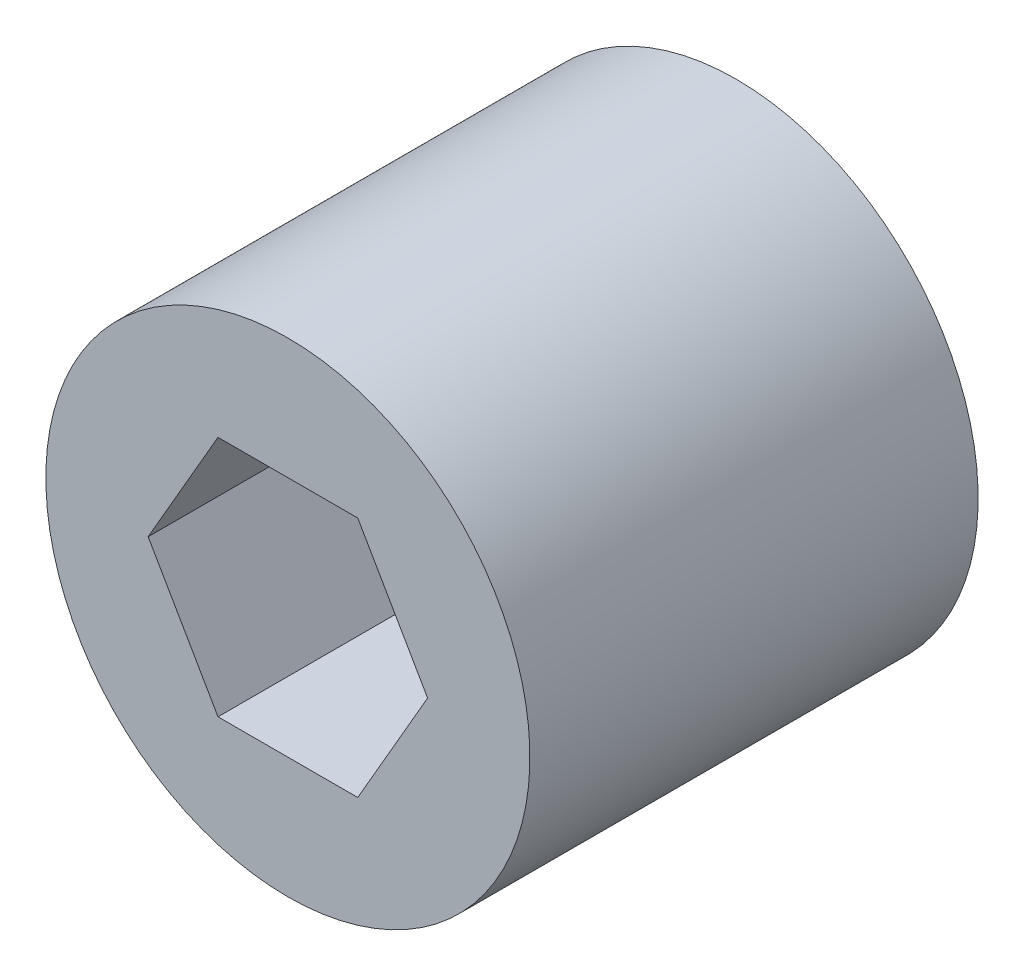
ISO-10303-21;
HEADER;
FILE_DESCRIPTION(('STEP AP214'),'2;1');
FILE_NAME('part.step','',(''),(''),'','','');
FILE_SCHEMA(('AUTOMOTIVE_DESIGN { 1 0 10303 214 1 1 1 1 }'));
ENDSEC;
DATA;
#1=APPLICATION_CONTEXT('core data for automotive mechanical design processes');
#2=APPLICATION_PROTOCOL_DEFINITION('international standard','automotive_design',2000,#1);
#3=PRODUCT_CONTEXT('',#1,'mechanical');
#4=PRODUCT('Part','Part','',(#3));
#5=PRODUCT_RELATED_PRODUCT_CATEGORY('part','',(#4));
#6=PRODUCT_DEFINITION_FORMATION('','',#4);
#7=PRODUCT_DEFINITION_CONTEXT('part definition',#1,'design');
#8=PRODUCT_DEFINITION('design','',#6,#7);
#9=PRODUCT_DEFINITION_SHAPE('','',#8);
#10=(LENGTH_UNIT() NAMED_UNIT(*) SI_UNIT(.MILLI.,.METRE.));
#11=(NAMED_UNIT(*) PLANE_ANGLE_UNIT() SI_UNIT($,.RADIAN.));
#12=(NAMED_UNIT(*) SI_UNIT($,.STERADIAN.) SOLID_ANGLE_UNIT());
#13=UNCERTAINTY_MEASURE_WITH_UNIT(LENGTH_MEASURE(1.E-05),#10,'distance_accuracy_value','');
#14=(GEOMETRIC_REPRESENTATION_CONTEXT(3) GLOBAL_UNCERTAINTY_ASSIGNED_CONTEXT((#13)) GLOBAL_UNIT_ASSIGNED_CONTEXT((#10,
#11,#12)) REPRESENTATION_CONTEXT('',''));
#15=CARTESIAN_POINT('',(0.,0.,0.));
#16=DIRECTION('',(0.,0.,1.));
#17=DIRECTION('',(1.,0.,0.));
#18=AXIS2_PLACEMENT_3D('',#15,#16,#17);
#19=CARTESIAN_POINT('',(0.,8.28601951286423,-23.5204));
#20=DIRECTION('',(0.,0.,1.));
#21=DIRECTION('',(0.,-1.,0.));
#22=AXIS2_PLACEMENT_3D('',#19,#20,#21);
#23=PLANE('',#22);
#24=DIRECTION('',(0.5,0.866025403784439,0.));
#25=VECTOR('',#24,1.);
#26=CARTESIAN_POINT('',(3.66617420935412,-6.35,-23.5204));
#27=LINE('',#26,#25);
#28=CARTESIAN_POINT('',(3.66617420935412,-6.35,-23.5204));
#29=VERTEX_POINT('',#28);
#30=CARTESIAN_POINT('',(7.33234841870825,0.,-23.5204));
#31=VERTEX_POINT('',#30);
#32=EDGE_CURVE('E94',#29,#31,#27,.T.);
#33=ORIENTED_EDGE('',*,*,#32,.T.);
#34=DIRECTION('',(-0.5,0.866025403784438,0.));
#35=VECTOR('',#34,1.);
#36=CARTESIAN_POINT('',(7.33234841870825,0.,-23.5204));
#37=LINE('',#36,#35);
#38=CARTESIAN_POINT('',(3.66617420935412,6.35,-23.5204));
#39=VERTEX_POINT('',#38);
#40=EDGE_CURVE('E88',#31,#39,#37,.T.);
#41=ORIENTED_EDGE('',*,*,#40,.T.);
#42=DIRECTION('',(-1.,0.,0.));
#43=VECTOR('',#42,1.);
#44=CARTESIAN_POINT('',(3.66617420935412,6.35,-23.5204));
#45=LINE('',#44,#43);
#46=CARTESIAN_POINT('',(-3.66617420935412,6.35,-23.5204));
#47=VERTEX_POINT('',#46);
#48=EDGE_CURVE('E97',#39,#47,#45,.T.);
#49=ORIENTED_EDGE('',*,*,#48,.T.);
#50=DIRECTION('',(-0.5,-0.866025403784439,0.));
#51=VECTOR('',#50,1.);
#52=CARTESIAN_POINT('',(-3.66617420935412,6.35,-23.5204));
#53=LINE('',#52,#51);
#54=CARTESIAN_POINT('',(-7.33234841870825,0.,-23.5204));
#55=VERTEX_POINT('',#54);
#56=EDGE_CURVE('E48',#47,#55,#53,.T.);
#57=ORIENTED_EDGE('',*,*,#56,.T.);
#58=DIRECTION('',(0.5,-0.866025403784438,0.));
#59=VECTOR('',#58,1.);
#60=CARTESIAN_POINT('',(-7.33234841870825,0.,-23.5204));
#61=LINE('',#60,#59);
#62=CARTESIAN_POINT('',(-3.66617420935412,-6.35,-23.5204));
#63=VERTEX_POINT('',#62);
#64=EDGE_CURVE('E111',#55,#63,#61,.T.);
#65=ORIENTED_EDGE('',*,*,#64,.T.);
#66=DIRECTION('',(1.,0.,0.));
#67=VECTOR('',#66,1.);
#68=CARTESIAN_POINT('',(-3.66617420935412,-6.35,-23.5204));
#69=LINE('',#68,#67);
#70=EDGE_CURVE('E114',#63,#29,#69,.T.);
#71=ORIENTED_EDGE('',*,*,#70,.T.);
#72=EDGE_LOOP('',(#33,#41,#49,#57,#65,#71));
#73=FACE_BOUND('',#72,.T.);
#74=CARTESIAN_POINT('',(0.,0.,-23.5204));
#75=DIRECTION('',(0.,0.,1.));
#76=DIRECTION('',(0.,-1.,0.));
#77=AXIS2_PLACEMENT_3D('',#74,#75,#76);
#78=CIRCLE('',#77,12.7);
#79=CARTESIAN_POINT('',(0.,-12.7,-23.5204));
#80=VERTEX_POINT('',#79);
#81=EDGE_CURVE('E41',#80,#80,#78,.T.);
#82=ORIENTED_EDGE('',*,*,#81,.F.);
#83=EDGE_LOOP('',(#82));
#84=FACE_BOUND('',#83,.T.);
#85=ADVANCED_FACE('F34',(#73,#84),#23,.F.);
#86=CARTESIAN_POINT('',(0.,8.28601951286423,0.));
#87=DIRECTION('',(0.,0.,-1.));
#88=DIRECTION('',(0.,1.,0.));
#89=AXIS2_PLACEMENT_3D('',#86,#87,#88);
#90=PLANE('',#89);
#91=DIRECTION('',(-1.,0.,0.));
#92=VECTOR('',#91,1.);
#93=CARTESIAN_POINT('',(3.66617420935412,6.35,0.));
#94=LINE('',#93,#92);
#95=CARTESIAN_POINT('',(3.66617420935412,6.35,0.));
#96=VERTEX_POINT('',#95);
#97=CARTESIAN_POINT('',(-3.66617420935412,6.35,0.));
#98=VERTEX_POINT('',#97);
#99=EDGE_CURVE('E118',#96,#98,#94,.T.);
#100=ORIENTED_EDGE('',*,*,#99,.F.);
#101=DIRECTION('',(-0.5,0.866025403784438,0.));
#102=VECTOR('',#101,1.);
#103=CARTESIAN_POINT('',(7.33234841870825,0.,0.));
#104=LINE('',#103,#102);
#105=CARTESIAN_POINT('',(7.33234841870825,0.,0.));
#106=VERTEX_POINT('',#105);
#107=EDGE_CURVE('E56',#106,#96,#104,.T.);
#108=ORIENTED_EDGE('',*,*,#107,.F.);
#109=DIRECTION('',(0.5,0.866025403784439,0.));
#110=VECTOR('',#109,1.);
#111=CARTESIAN_POINT('',(3.66617420935412,-6.35,0.));
#112=LINE('',#111,#110);
#113=CARTESIAN_POINT('',(3.66617420935412,-6.35,0.));
#114=VERTEX_POINT('',#113);
#115=EDGE_CURVE('E104',#114,#106,#112,.T.);
#116=ORIENTED_EDGE('',*,*,#115,.F.);
#117=DIRECTION('',(1.,0.,0.));
#118=VECTOR('',#117,1.);
#119=CARTESIAN_POINT('',(-3.66617420935412,-6.35,0.));
#120=LINE('',#119,#118);
#121=CARTESIAN_POINT('',(-3.66617420935412,-6.35,0.));
#122=VERTEX_POINT('',#121);
#123=EDGE_CURVE('E107',#122,#114,#120,.T.);
#124=ORIENTED_EDGE('',*,*,#123,.F.);
#125=DIRECTION('',(0.5,-0.866025403784438,0.));
#126=VECTOR('',#125,1.);
#127=CARTESIAN_POINT('',(-7.33234841870825,0.,0.));
#128=LINE('',#127,#126);
#129=CARTESIAN_POINT('',(-7.33234841870825,0.,0.));
#130=VERTEX_POINT('',#129);
#131=EDGE_CURVE('E123',#130,#122,#128,.T.);
#132=ORIENTED_EDGE('',*,*,#131,.F.);
#133=DIRECTION('',(-0.5,-0.866025403784439,0.));
#134=VECTOR('',#133,1.);
#135=CARTESIAN_POINT('',(-3.66617420935412,6.35,0.));
#136=LINE('',#135,#134);
#137=EDGE_CURVE('E120',#98,#130,#136,.T.);
#138=ORIENTED_EDGE('',*,*,#137,.F.);
#139=EDGE_LOOP('',(#100,#108,#116,#124,#132,#138));
#140=FACE_BOUND('',#139,.T.);
#141=CARTESIAN_POINT('',(0.,0.,0.));
#142=DIRECTION('',(0.,0.,1.));
#143=DIRECTION('',(0.,-1.,0.));
#144=AXIS2_PLACEMENT_3D('',#141,#142,#143);
#145=CIRCLE('',#144,12.7);
#146=CARTESIAN_POINT('',(0.,-12.7,0.));
#147=VERTEX_POINT('',#146);
#148=EDGE_CURVE('E11',#147,#147,#145,.T.);
#149=ORIENTED_EDGE('',*,*,#148,.T.);
#150=EDGE_LOOP('',(#149));
#151=FACE_BOUND('',#150,.T.);
#152=ADVANCED_FACE('F141',(#140,#151),#90,.F.);
#153=CARTESIAN_POINT('',(0.,0.,0.));
#154=DIRECTION('',(0.,0.,1.));
#155=DIRECTION('',(0.,-1.,0.));
#156=AXIS2_PLACEMENT_3D('',#153,#154,#155);
#157=CYLINDRICAL_SURFACE('',#156,12.7);
#158=ORIENTED_EDGE('',*,*,#148,.F.);
#159=EDGE_LOOP('',(#158));
#160=FACE_BOUND('',#159,.T.);
#161=ORIENTED_EDGE('',*,*,#81,.T.);
#162=EDGE_LOOP('',(#161));
#163=FACE_BOUND('',#162,.T.);
#164=ADVANCED_FACE('F139',(#160,#163),#157,.T.);
#165=CARTESIAN_POINT('',(7.33234841870825,0.,-23.5204));
#166=DIRECTION('',(0.866025403784438,0.5,0.));
#167=DIRECTION('',(-0.5,0.866025403784439,0.));
#168=AXIS2_PLACEMENT_3D('',#165,#166,#167);
#169=PLANE('',#168);
#170=ORIENTED_EDGE('',*,*,#107,.T.);
#171=DIRECTION('',(0.,0.,1.));
#172=VECTOR('',#171,1.);
#173=CARTESIAN_POINT('',(3.66617420935412,6.35,-23.5204));
#174=LINE('',#173,#172);
#175=EDGE_CURVE('E84',#39,#96,#174,.T.);
#176=ORIENTED_EDGE('',*,*,#175,.F.);
#177=ORIENTED_EDGE('',*,*,#40,.F.);
#178=DIRECTION('',(0.,0.,1.));
#179=VECTOR('',#178,1.);
#180=CARTESIAN_POINT('',(7.33234841870825,0.,-23.5204));
#181=LINE('',#180,#179);
#182=EDGE_CURVE('E128',#31,#106,#181,.T.);
#183=ORIENTED_EDGE('',*,*,#182,.T.);
#184=EDGE_LOOP('',(#170,#176,#177,#183));
#185=FACE_BOUND('',#184,.T.);
#186=ADVANCED_FACE('F86',(#185),#169,.F.);
#187=CARTESIAN_POINT('',(3.66617420935412,-6.35,-23.5204));
#188=DIRECTION('',(0.866025403784439,-0.5,0.));
#189=DIRECTION('',(0.5,0.866025403784439,0.));
#190=AXIS2_PLACEMENT_3D('',#187,#188,#189);
#191=PLANE('',#190);
#192=ORIENTED_EDGE('',*,*,#115,.T.);
#193=ORIENTED_EDGE('',*,*,#182,.F.);
#194=ORIENTED_EDGE('',*,*,#32,.F.);
#195=DIRECTION('',(0.,0.,1.));
#196=VECTOR('',#195,1.);
#197=CARTESIAN_POINT('',(3.66617420935412,-6.35,-23.5204));
#198=LINE('',#197,#196);
#199=EDGE_CURVE('E130',#29,#114,#198,.T.);
#200=ORIENTED_EDGE('',*,*,#199,.T.);
#201=EDGE_LOOP('',(#192,#193,#194,#200));
#202=FACE_BOUND('',#201,.T.);
#203=ADVANCED_FACE('F155',(#202),#191,.F.);
#204=CARTESIAN_POINT('',(-3.66617420935412,-6.35,-23.5204));
#205=DIRECTION('',(0.,-1.,0.));
#206=DIRECTION('',(1.,0.,0.));
#207=AXIS2_PLACEMENT_3D('',#204,#205,#206);
#208=PLANE('',#207);
#209=ORIENTED_EDGE('',*,*,#123,.T.);
#210=ORIENTED_EDGE('',*,*,#199,.F.);
#211=ORIENTED_EDGE('',*,*,#70,.F.);
#212=DIRECTION('',(0.,0.,1.));
#213=VECTOR('',#212,1.);
#214=CARTESIAN_POINT('',(-3.66617420935412,-6.35,-23.5204));
#215=LINE('',#214,#213);
#216=EDGE_CURVE('E132',#63,#122,#215,.T.);
#217=ORIENTED_EDGE('',*,*,#216,.T.);
#218=EDGE_LOOP('',(#209,#210,#211,#217));
#219=FACE_BOUND('',#218,.T.);
#220=ADVANCED_FACE('F164',(#219),#208,.F.);
#221=CARTESIAN_POINT('',(-7.33234841870825,0.,-23.5204));
#222=DIRECTION('',(-0.866025403784438,-0.5,0.));
#223=DIRECTION('',(0.5,-0.866025403784439,0.));
#224=AXIS2_PLACEMENT_3D('',#221,#222,#223);
#225=PLANE('',#224);
#226=ORIENTED_EDGE('',*,*,#131,.T.);
#227=ORIENTED_EDGE('',*,*,#216,.F.);
#228=ORIENTED_EDGE('',*,*,#64,.F.);
#229=DIRECTION('',(0.,0.,1.));
#230=VECTOR('',#229,1.);
#231=CARTESIAN_POINT('',(-7.33234841870825,0.,-23.5204));
#232=LINE('',#231,#230);
#233=EDGE_CURVE('E134',#55,#130,#232,.T.);
#234=ORIENTED_EDGE('',*,*,#233,.T.);
#235=EDGE_LOOP('',(#226,#227,#228,#234));
#236=FACE_BOUND('',#235,.T.);
#237=ADVANCED_FACE('F161',(#236),#225,.F.);
#238=CARTESIAN_POINT('',(-3.66617420935412,6.35,-23.5204));
#239=DIRECTION('',(-0.866025403784439,0.5,0.));
#240=DIRECTION('',(-0.5,-0.866025403784439,0.));
#241=AXIS2_PLACEMENT_3D('',#238,#239,#240);
#242=PLANE('',#241);
#243=ORIENTED_EDGE('',*,*,#137,.T.);
#244=ORIENTED_EDGE('',*,*,#233,.F.);
#245=ORIENTED_EDGE('',*,*,#56,.F.);
#246=DIRECTION('',(0.,0.,1.));
#247=VECTOR('',#246,1.);
#248=CARTESIAN_POINT('',(-3.66617420935412,6.35,-23.5204));
#249=LINE('',#248,#247);
#250=EDGE_CURVE('E93',#47,#98,#249,.T.);
#251=ORIENTED_EDGE('',*,*,#250,.T.);
#252=EDGE_LOOP('',(#243,#244,#245,#251));
#253=FACE_BOUND('',#252,.T.);
#254=ADVANCED_FACE('F158',(#253),#242,.F.);
#255=CARTESIAN_POINT('',(3.66617420935412,6.35,-23.5204));
#256=DIRECTION('',(0.,1.,0.));
#257=DIRECTION('',(-1.,0.,0.));
#258=AXIS2_PLACEMENT_3D('',#255,#256,#257);
#259=PLANE('',#258);
#260=ORIENTED_EDGE('',*,*,#99,.T.);
#261=ORIENTED_EDGE('',*,*,#250,.F.);
#262=ORIENTED_EDGE('',*,*,#48,.F.);
#263=ORIENTED_EDGE('',*,*,#175,.T.);
#264=EDGE_LOOP('',(#260,#261,#262,#263));
#265=FACE_BOUND('',#264,.T.);
#266=ADVANCED_FACE('F98',(#265),#259,.F.);
#267=CLOSED_SHELL('',(#85,#152,#164,#186,#203,#220,#237,#254,#266));
#268=MANIFOLD_SOLID_BREP('B2',#267);
#269=ADVANCED_BREP_SHAPE_REPRESENTATION('',(#18,#268),#14);
#270=SHAPE_DEFINITION_REPRESENTATION(#9,#269);
ENDSEC;
END-ISO-10303-21;
